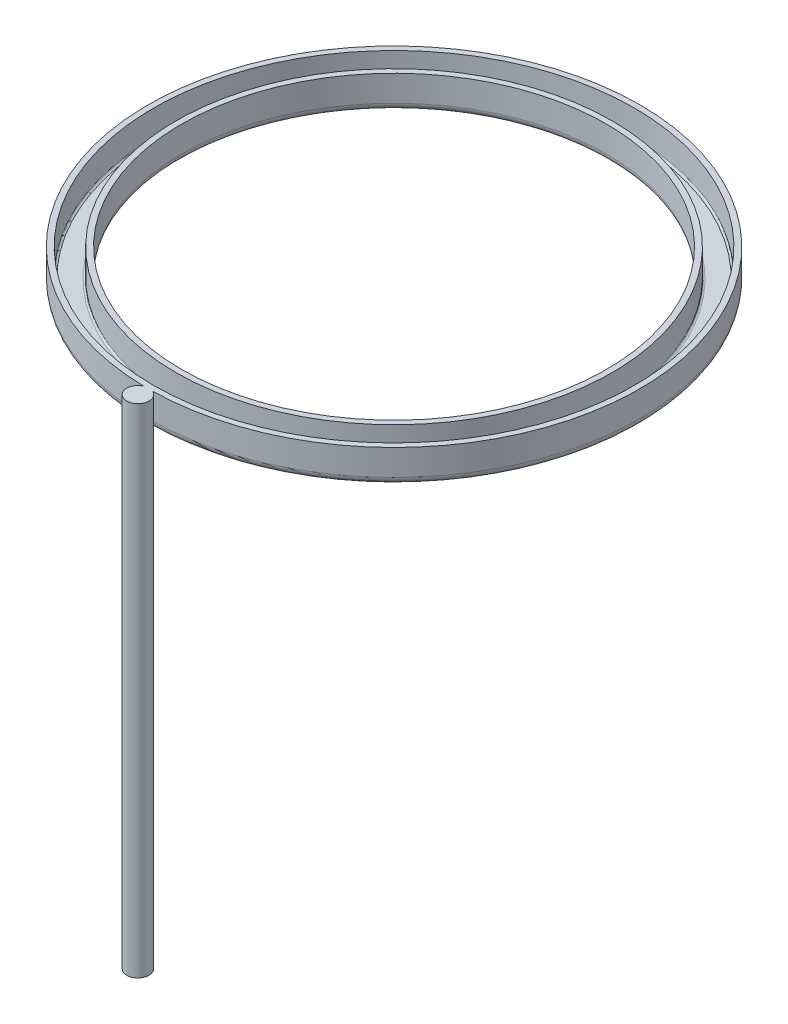
ISO-10303-21;
HEADER;
FILE_DESCRIPTION(('STEP AP214'),'2;1');
FILE_NAME('part.step','',(''),(''),'','','');
FILE_SCHEMA(('AUTOMOTIVE_DESIGN { 1 0 10303 214 1 1 1 1 }'));
ENDSEC;
DATA;
#1=APPLICATION_CONTEXT('core data for automotive mechanical design processes');
#2=APPLICATION_PROTOCOL_DEFINITION('international standard','automotive_design',2000,#1);
#3=PRODUCT_CONTEXT('',#1,'mechanical');
#4=PRODUCT('Part','Part','',(#3));
#5=PRODUCT_RELATED_PRODUCT_CATEGORY('part','',(#4));
#6=PRODUCT_DEFINITION_FORMATION('','',#4);
#7=PRODUCT_DEFINITION_CONTEXT('part definition',#1,'design');
#8=PRODUCT_DEFINITION('design','',#6,#7);
#9=PRODUCT_DEFINITION_SHAPE('','',#8);
#10=(LENGTH_UNIT() NAMED_UNIT(*) SI_UNIT(.MILLI.,.METRE.));
#11=(NAMED_UNIT(*) PLANE_ANGLE_UNIT() SI_UNIT($,.RADIAN.));
#12=(NAMED_UNIT(*) SI_UNIT($,.STERADIAN.) SOLID_ANGLE_UNIT());
#13=UNCERTAINTY_MEASURE_WITH_UNIT(LENGTH_MEASURE(1.E-05),#10,'distance_accuracy_value','');
#14=(GEOMETRIC_REPRESENTATION_CONTEXT(3) GLOBAL_UNCERTAINTY_ASSIGNED_CONTEXT((#13)) GLOBAL_UNIT_ASSIGNED_CONTEXT((#10,
#11,#12)) REPRESENTATION_CONTEXT('',''));
#15=CARTESIAN_POINT('',(0.,0.,0.));
#16=DIRECTION('',(0.,0.,1.));
#17=DIRECTION('',(1.,0.,0.));
#18=AXIS2_PLACEMENT_3D('',#15,#16,#17);
#19=CARTESIAN_POINT('',(0.,22.5592062491873,0.));
#20=DIRECTION('',(0.,1.,0.));
#21=DIRECTION('',(0.,0.,1.));
#22=AXIS2_PLACEMENT_3D('',#19,#20,#21);
#23=CYLINDRICAL_SURFACE('',#22,5.725);
#24=CARTESIAN_POINT('',(0.,0.900000000000001,0.));
#25=DIRECTION('',(0.,1.,0.));
#26=DIRECTION('',(0.,0.,1.));
#27=AXIS2_PLACEMENT_3D('',#24,#25,#26);
#28=CIRCLE('',#27,5.725);
#29=CARTESIAN_POINT('',(0.,0.900000000000001,5.725));
#30=VERTEX_POINT('',#29);
#31=EDGE_CURVE('E47',#30,#30,#28,.T.);
#32=ORIENTED_EDGE('',*,*,#31,.T.);
#33=EDGE_LOOP('',(#32));
#34=FACE_BOUND('',#33,.T.);
#35=CARTESIAN_POINT('',(0.,0.199999999999999,0.));
#36=DIRECTION('',(0.,1.,0.));
#37=DIRECTION('',(0.,0.,1.));
#38=AXIS2_PLACEMENT_3D('',#35,#36,#37);
#39=CIRCLE('',#38,5.725);
#40=CARTESIAN_POINT('',(0.,0.199999999999999,5.725));
#41=VERTEX_POINT('',#40);
#42=EDGE_CURVE('E76',#41,#41,#39,.T.);
#43=ORIENTED_EDGE('',*,*,#42,.F.);
#44=EDGE_LOOP('',(#43));
#45=FACE_BOUND('',#44,.T.);
#46=ADVANCED_FACE('F34',(#34,#45),#23,.F.);
#47=CARTESIAN_POINT('',(-5.875,0.9,0.));
#48=DIRECTION('',(0.,-1.,0.));
#49=DIRECTION('',(0.,0.,-1.));
#50=AXIS2_PLACEMENT_3D('',#47,#48,#49);
#51=PLANE('',#50);
#52=ORIENTED_EDGE('',*,*,#31,.F.);
#53=EDGE_LOOP('',(#52));
#54=FACE_BOUND('',#53,.T.);
#55=CARTESIAN_POINT('',(0.,0.899999999999998,0.));
#56=DIRECTION('',(0.,1.,0.));
#57=DIRECTION('',(0.,0.,1.));
#58=AXIS2_PLACEMENT_3D('',#55,#56,#57);
#59=CIRCLE('',#58,5.875);
#60=CARTESIAN_POINT('',(0.,0.899999999999998,5.875));
#61=VERTEX_POINT('',#60);
#62=EDGE_CURVE('E109',#61,#61,#59,.T.);
#63=ORIENTED_EDGE('',*,*,#62,.T.);
#64=EDGE_LOOP('',(#63));
#65=FACE_BOUND('',#64,.T.);
#66=ADVANCED_FACE('F116',(#54,#65),#51,.F.);
#67=CARTESIAN_POINT('',(0.,22.5592062491873,0.));
#68=DIRECTION('',(0.,1.,0.));
#69=DIRECTION('',(0.,0.,1.));
#70=AXIS2_PLACEMENT_3D('',#67,#68,#69);
#71=CYLINDRICAL_SURFACE('',#70,5.875);
#72=ORIENTED_EDGE('',*,*,#62,.F.);
#73=EDGE_LOOP('',(#72));
#74=FACE_BOUND('',#73,.T.);
#75=CARTESIAN_POINT('',(0.,0.199999999999999,0.));
#76=DIRECTION('',(0.,1.,0.));
#77=DIRECTION('',(0.,0.,1.));
#78=AXIS2_PLACEMENT_3D('',#75,#76,#77);
#79=CIRCLE('',#78,5.875);
#80=CARTESIAN_POINT('',(0.,0.199999999999999,5.875));
#81=VERTEX_POINT('',#80);
#82=EDGE_CURVE('E106',#81,#81,#79,.T.);
#83=ORIENTED_EDGE('',*,*,#82,.T.);
#84=EDGE_LOOP('',(#83));
#85=FACE_BOUND('',#84,.T.);
#86=ADVANCED_FACE('F119',(#74,#85),#71,.T.);
#87=CARTESIAN_POINT('',(0.,0.2,0.));
#88=DIRECTION('',(0.,1.,0.));
#89=DIRECTION('',(0.,0.,1.));
#90=AXIS2_PLACEMENT_3D('',#87,#88,#89);
#91=TOROIDAL_SURFACE('',#90,5.925,0.0499999999999998);
#92=ORIENTED_EDGE('',*,*,#82,.F.);
#93=EDGE_LOOP('',(#92));
#94=FACE_BOUND('',#93,.T.);
#95=CARTESIAN_POINT('',(0.,0.150000000000001,0.));
#96=DIRECTION('',(0.,1.,0.));
#97=DIRECTION('',(0.,0.,1.));
#98=AXIS2_PLACEMENT_3D('',#95,#96,#97);
#99=CIRCLE('',#98,5.925);
#100=CARTESIAN_POINT('',(0.,0.150000000000001,5.925));
#101=VERTEX_POINT('',#100);
#102=EDGE_CURVE('E103',#101,#101,#99,.T.);
#103=ORIENTED_EDGE('',*,*,#102,.T.);
#104=EDGE_LOOP('',(#103));
#105=FACE_BOUND('',#104,.T.);
#106=ADVANCED_FACE('F124',(#94,#105),#91,.F.);
#107=CARTESIAN_POINT('',(-6.425,0.15,0.));
#108=DIRECTION('',(0.,-1.,0.));
#109=DIRECTION('',(0.,0.,-1.));
#110=AXIS2_PLACEMENT_3D('',#107,#108,#109);
#111=PLANE('',#110);
#112=ORIENTED_EDGE('',*,*,#102,.F.);
#113=EDGE_LOOP('',(#112));
#114=FACE_BOUND('',#113,.T.);
#115=CARTESIAN_POINT('',(0.,0.150000000000001,0.));
#116=DIRECTION('',(0.,1.,0.));
#117=DIRECTION('',(0.,0.,1.));
#118=AXIS2_PLACEMENT_3D('',#115,#116,#117);
#119=CIRCLE('',#118,6.425);
#120=CARTESIAN_POINT('',(0.,0.150000000000001,6.425));
#121=VERTEX_POINT('',#120);
#122=EDGE_CURVE('E100',#121,#121,#119,.T.);
#123=ORIENTED_EDGE('',*,*,#122,.T.);
#124=EDGE_LOOP('',(#123));
#125=FACE_BOUND('',#124,.T.);
#126=ADVANCED_FACE('F130',(#114,#125),#111,.F.);
#127=CARTESIAN_POINT('',(0.,0.2,0.));
#128=DIRECTION('',(0.,1.,0.));
#129=DIRECTION('',(0.,0.,1.));
#130=AXIS2_PLACEMENT_3D('',#127,#128,#129);
#131=TOROIDAL_SURFACE('',#130,6.425,0.0500000000000003);
#132=ORIENTED_EDGE('',*,*,#122,.F.);
#133=EDGE_LOOP('',(#132));
#134=FACE_BOUND('',#133,.T.);
#135=CARTESIAN_POINT('',(0.,0.199999999999999,0.));
#136=DIRECTION('',(0.,1.,0.));
#137=DIRECTION('',(0.,0.,1.));
#138=AXIS2_PLACEMENT_3D('',#135,#136,#137);
#139=CIRCLE('',#138,6.475);
#140=CARTESIAN_POINT('',(0.,0.199999999999999,6.475));
#141=VERTEX_POINT('',#140);
#142=EDGE_CURVE('E97',#141,#141,#139,.T.);
#143=ORIENTED_EDGE('',*,*,#142,.T.);
#144=EDGE_LOOP('',(#143));
#145=FACE_BOUND('',#144,.T.);
#146=ADVANCED_FACE('F136',(#134,#145),#131,.F.);
#147=CARTESIAN_POINT('',(0.,22.5592062491873,0.));
#148=DIRECTION('',(0.,1.,0.));
#149=DIRECTION('',(0.,0.,1.));
#150=AXIS2_PLACEMENT_3D('',#147,#148,#149);
#151=CYLINDRICAL_SURFACE('',#150,6.475);
#152=ORIENTED_EDGE('',*,*,#142,.F.);
#153=EDGE_LOOP('',(#152));
#154=FACE_BOUND('',#153,.T.);
#155=CARTESIAN_POINT('',(0.,0.899999999999998,0.));
#156=DIRECTION('',(0.,1.,0.));
#157=DIRECTION('',(0.,0.,1.));
#158=AXIS2_PLACEMENT_3D('',#155,#156,#157);
#159=CIRCLE('',#158,6.475);
#160=CARTESIAN_POINT('',(0.,0.899999999999998,6.475));
#161=VERTEX_POINT('',#160);
#162=EDGE_CURVE('E94',#161,#161,#159,.T.);
#163=ORIENTED_EDGE('',*,*,#162,.T.);
#164=EDGE_LOOP('',(#163));
#165=FACE_BOUND('',#164,.T.);
#166=ADVANCED_FACE('F142',(#154,#165),#151,.F.);
#167=CARTESIAN_POINT('',(-6.625,0.9,0.));
#168=DIRECTION('',(0.,-1.,0.));
#169=DIRECTION('',(0.,0.,-1.));
#170=AXIS2_PLACEMENT_3D('',#167,#168,#169);
#171=PLANE('',#170);
#172=ORIENTED_EDGE('',*,*,#162,.F.);
#173=EDGE_LOOP('',(#172));
#174=FACE_BOUND('',#173,.T.);
#175=CARTESIAN_POINT('',(0.,0.900000000000001,0.));
#176=DIRECTION('',(0.,1.,0.));
#177=DIRECTION('',(0.,0.,1.));
#178=AXIS2_PLACEMENT_3D('',#175,#176,#177);
#179=CIRCLE('',#178,6.625);
#180=CARTESIAN_POINT('',(0.117477650061137,0.900000000000001,6.62395833333333));
#181=VERTEX_POINT('',#180);
#182=CARTESIAN_POINT('',(-0.117477650061137,0.900000000000001,6.62395833333333));
#183=VERTEX_POINT('',#182);
#184=EDGE_CURVE('E58',#181,#183,#179,.T.);
#185=ORIENTED_EDGE('',*,*,#184,.T.);
#186=CARTESIAN_POINT('',(0.,0.9,6.9));
#187=DIRECTION('',(0.,1.,0.));
#188=DIRECTION('',(0.,0.,1.));
#189=AXIS2_PLACEMENT_3D('',#186,#187,#188);
#190=CIRCLE('',#189,0.3);
#191=EDGE_CURVE('E79',#183,#181,#190,.T.);
#192=ORIENTED_EDGE('',*,*,#191,.T.);
#193=EDGE_LOOP('',(#185,#192));
#194=FACE_BOUND('',#193,.T.);
#195=ADVANCED_FACE('F148',(#174,#194),#171,.F.);
#196=CARTESIAN_POINT('',(0.,22.5592062491873,0.));
#197=DIRECTION('',(0.,1.,0.));
#198=DIRECTION('',(0.,0.,1.));
#199=AXIS2_PLACEMENT_3D('',#196,#197,#198);
#200=CYLINDRICAL_SURFACE('',#199,6.625);
#201=DIRECTION('',(0.,1.,0.));
#202=VECTOR('',#201,1.);
#203=CARTESIAN_POINT('',(0.117477650061136,-5.8,6.62395833333333));
#204=LINE('',#203,#202);
#205=CARTESIAN_POINT('',(0.117477650061137,0.20000000001393,6.62395833333333));
#206=VERTEX_POINT('',#205);
#207=EDGE_CURVE('E71',#206,#181,#204,.T.);
#208=ORIENTED_EDGE('',*,*,#207,.F.);
#209=CARTESIAN_POINT('',(0.,0.199999999999999,0.));
#210=DIRECTION('',(0.,1.,0.));
#211=DIRECTION('',(0.,0.,1.));
#212=AXIS2_PLACEMENT_3D('',#209,#210,#211);
#213=CIRCLE('',#212,6.625);
#214=CARTESIAN_POINT('',(-0.117477650061137,0.199999999999999,6.62395833333333));
#215=VERTEX_POINT('',#214);
#216=EDGE_CURVE('E66',#206,#215,#213,.T.);
#217=ORIENTED_EDGE('',*,*,#216,.T.);
#218=DIRECTION('',(0.,1.,0.));
#219=VECTOR('',#218,1.);
#220=CARTESIAN_POINT('',(-0.117477650061136,-5.8,6.62395833333333));
#221=LINE('',#220,#219);
#222=EDGE_CURVE('E54',#183,#215,#221,.F.);
#223=ORIENTED_EDGE('',*,*,#222,.F.);
#224=ORIENTED_EDGE('',*,*,#184,.F.);
#225=EDGE_LOOP('',(#208,#217,#223,#224));
#226=FACE_BOUND('',#225,.T.);
#227=ADVANCED_FACE('F72',(#226),#200,.T.);
#228=CARTESIAN_POINT('',(0.,0.2,0.));
#229=DIRECTION('',(0.,1.,0.));
#230=DIRECTION('',(0.,0.,1.));
#231=AXIS2_PLACEMENT_3D('',#228,#229,#230);
#232=TOROIDAL_SURFACE('',#231,6.425,0.2);
#233=CARTESIAN_POINT('',(-0.117477424452947,0.200199999999936,6.62395823731371));
#234=CARTESIAN_POINT('',(-0.117493358419675,0.195410567926204,6.62396867575194));
#235=CARTESIAN_POINT('',(-0.117111411832353,0.190624810307204,6.62380247469931));
#236=CARTESIAN_POINT('',(-0.115592218155275,0.18121547545121,6.62316134540012));
#237=CARTESIAN_POINT('',(-0.114458076688651,0.176591313322827,6.62268768673899));
#238=CARTESIAN_POINT('',(-0.111475294515229,0.167620988798098,6.62147590569512));
#239=CARTESIAN_POINT('',(-0.109627053413964,0.163274672503543,6.62073793123861));
#240=CARTESIAN_POINT('',(-0.105283122863901,0.15495781606709,6.6190713715067));
#241=CARTESIAN_POINT('',(-0.102787040280426,0.150987506103767,6.61814267056293));
#242=CARTESIAN_POINT('',(-0.0971175200584906,0.143344643421387,6.61613816113953));
#243=CARTESIAN_POINT('',(-0.0939207509592384,0.139690652763249,6.61505791919867));
#244=CARTESIAN_POINT('',(-0.0870173740080533,0.132911219052218,6.61287443187822));
#245=CARTESIAN_POINT('',(-0.0833105586161431,0.129785992315694,6.61177117729051));
#246=CARTESIAN_POINT('',(-0.0749586864551937,0.123690627800654,6.60947919379753));
#247=CARTESIAN_POINT('',(-0.0702545268975759,0.120798433410196,6.60829904312042));
#248=CARTESIAN_POINT('',(-0.0604535476620065,0.115697275042116,6.6061111693056));
#249=CARTESIAN_POINT('',(-0.0553565101720337,0.113488693513035,6.60510354282724));
#250=CARTESIAN_POINT('',(-0.0439978896572318,0.109407251831239,6.60317904893592));
#251=CARTESIAN_POINT('',(-0.0376854336848521,0.107654900243559,6.60230657462613));
#252=CARTESIAN_POINT('',(-0.0248426749893189,0.105001102401386,6.600960456815));
#253=CARTESIAN_POINT('',(-0.0183122328793765,0.104100211821134,6.60048707378742));
#254=CARTESIAN_POINT('',(-0.00423247318337452,0.103051964691408,6.59993591512828));
#255=CARTESIAN_POINT('',(0.00332914857048123,0.103030611707442,6.59992430013409));
#256=CARTESIAN_POINT('',(0.0183643408044509,0.104063339819727,6.6004680009375));
#257=CARTESIAN_POINT('',(0.0258378332769263,0.105118310503039,6.60102378569415));
#258=CARTESIAN_POINT('',(0.0407730438593247,0.108411497098034,6.60268511978922));
#259=CARTESIAN_POINT('',(0.0482227670191234,0.110694565838593,6.60381140758712));
#260=CARTESIAN_POINT('',(0.0625112592961097,0.116550402861268,6.60649547199155));
#261=CARTESIAN_POINT('',(0.0693511353291755,0.120120772606431,6.60805244488525));
#262=CARTESIAN_POINT('',(0.0802901355077364,0.127410484680106,6.61090475122547));
#263=CARTESIAN_POINT('',(0.0846191436862528,0.130805686922304,6.61215056309705));
#264=CARTESIAN_POINT('',(0.0926443223034685,0.13828194140605,6.61463249389704));
#265=CARTESIAN_POINT('',(0.0963409115702602,0.14236253616006,6.61586861871913));
#266=CARTESIAN_POINT('',(0.102977583818124,0.151185866883813,6.61820546817975));
#267=CARTESIAN_POINT('',(0.105911984235637,0.15593319156381,6.61930514551349));
#268=CARTESIAN_POINT('',(0.110847880312594,0.165942611639706,6.62121727586969));
#269=CARTESIAN_POINT('',(0.112850518821425,0.171204066790047,6.62203008045779));
#270=CARTESIAN_POINT('',(0.115382970083866,0.180444206993945,6.62307383863291));
#271=CARTESIAN_POINT('',(0.116173224633171,0.184341931899036,6.62340578739462));
#272=CARTESIAN_POINT('',(0.117226210141097,0.192225372438092,6.6238513219509));
#273=CARTESIAN_POINT('',(0.117488224255034,0.196211200230774,6.62396461100611));
#274=CARTESIAN_POINT('',(0.117477424451954,0.200199999999631,6.62395823731882));
#275=B_SPLINE_CURVE_WITH_KNOTS('',3,(#233,#234,#235,#236,#237,#238,#239,#240,#241,#242,#243,
#244,#245,#246,#247,#248,#249,#250,#251,#252,#253,#254,#255,#256,#257,#258,#259,#260,#261,#262,
#263,#264,#265,#266,#267,#268,#269,#270,#271,#272,#273,#274),.UNSPECIFIED.,.F.,.F.,(4,2,2,2,2,2,
2,2,2,2,2,2,2,2,2,2,2,2,2,2,4),(0.,0.0143418504793326,0.0286248526540294,0.0428998737023752,
0.0571835777095052,0.0720455547284063,0.0869135971307995,0.103789556289038,0.120674939741564,
0.140424741415388,0.160187423178223,0.18277276505724,0.205376788971977,0.228868754204609,
0.252317172818816,0.269172683469214,0.286016987748055,0.302983487898271,0.319929122625966,
0.331861880852947,0.343810821468656),.UNSPECIFIED.);
#276=EDGE_CURVE('E11',#215,#206,#275,.T.);
#277=ORIENTED_EDGE('',*,*,#276,.F.);
#278=ORIENTED_EDGE('',*,*,#216,.F.);
#279=EDGE_LOOP('',(#277,#278));
#280=FACE_BOUND('',#279,.T.);
#281=CARTESIAN_POINT('',(0.,0.,0.));
#282=DIRECTION('',(0.,1.,0.));
#283=DIRECTION('',(0.,0.,1.));
#284=AXIS2_PLACEMENT_3D('',#281,#282,#283);
#285=CIRCLE('',#284,6.425);
#286=CARTESIAN_POINT('',(0.,0.,6.425));
#287=VERTEX_POINT('',#286);
#288=EDGE_CURVE('E69',#287,#287,#285,.T.);
#289=ORIENTED_EDGE('',*,*,#288,.T.);
#290=EDGE_LOOP('',(#289));
#291=FACE_BOUND('',#290,.T.);
#292=ADVANCED_FACE('F67',(#280,#291),#232,.T.);
#293=CARTESIAN_POINT('',(-6.425,0.,0.));
#294=DIRECTION('',(0.,-1.,0.));
#295=DIRECTION('',(0.,0.,-1.));
#296=AXIS2_PLACEMENT_3D('',#293,#294,#295);
#297=PLANE('',#296);
#298=CARTESIAN_POINT('',(0.,0.,0.));
#299=DIRECTION('',(0.,1.,0.));
#300=DIRECTION('',(0.,0.,1.));
#301=AXIS2_PLACEMENT_3D('',#298,#299,#300);
#302=CIRCLE('',#301,5.925);
#303=CARTESIAN_POINT('',(0.,0.,5.925));
#304=VERTEX_POINT('',#303);
#305=EDGE_CURVE('E88',#304,#304,#302,.T.);
#306=ORIENTED_EDGE('',*,*,#305,.T.);
#307=EDGE_LOOP('',(#306));
#308=FACE_BOUND('',#307,.T.);
#309=ORIENTED_EDGE('',*,*,#288,.F.);
#310=EDGE_LOOP('',(#309));
#311=FACE_BOUND('',#310,.T.);
#312=ADVANCED_FACE('F196',(#308,#311),#297,.T.);
#313=CARTESIAN_POINT('',(0.,0.2,0.));
#314=DIRECTION('',(0.,1.,0.));
#315=DIRECTION('',(0.,0.,1.));
#316=AXIS2_PLACEMENT_3D('',#313,#314,#315);
#317=TOROIDAL_SURFACE('',#316,5.925,0.2);
#318=ORIENTED_EDGE('',*,*,#42,.T.);
#319=EDGE_LOOP('',(#318));
#320=FACE_BOUND('',#319,.T.);
#321=ORIENTED_EDGE('',*,*,#305,.F.);
#322=EDGE_LOOP('',(#321));
#323=FACE_BOUND('',#322,.T.);
#324=ADVANCED_FACE('F201',(#320,#323),#317,.T.);
#325=CARTESIAN_POINT('',(0.,-12.5,6.9));
#326=DIRECTION('',(0.,1.,0.));
#327=DIRECTION('',(0.,0.,1.));
#328=AXIS2_PLACEMENT_3D('',#325,#326,#327);
#329=CYLINDRICAL_SURFACE('',#328,0.3);
#330=CARTESIAN_POINT('',(0.,-12.5,6.9));
#331=DIRECTION('',(0.,1.,0.));
#332=DIRECTION('',(0.,0.,1.));
#333=AXIS2_PLACEMENT_3D('',#330,#331,#332);
#334=CIRCLE('',#333,0.3);
#335=CARTESIAN_POINT('',(0.,-12.5,7.2));
#336=VERTEX_POINT('',#335);
#337=EDGE_CURVE('E80',#336,#336,#334,.T.);
#338=ORIENTED_EDGE('',*,*,#337,.T.);
#339=EDGE_LOOP('',(#338));
#340=FACE_BOUND('',#339,.T.);
#341=ORIENTED_EDGE('',*,*,#276,.T.);
#342=ORIENTED_EDGE('',*,*,#207,.T.);
#343=ORIENTED_EDGE('',*,*,#191,.F.);
#344=ORIENTED_EDGE('',*,*,#222,.T.);
#345=EDGE_LOOP('',(#341,#342,#343,#344));
#346=FACE_BOUND('',#345,.T.);
#347=ADVANCED_FACE('F78',(#340,#346),#329,.T.);
#348=CARTESIAN_POINT('',(0.,-12.5,6.9));
#349=DIRECTION('',(0.,1.,0.));
#350=DIRECTION('',(0.,0.,1.));
#351=AXIS2_PLACEMENT_3D('',#348,#349,#350);
#352=PLANE('',#351);
#353=ORIENTED_EDGE('',*,*,#337,.F.);
#354=EDGE_LOOP('',(#353));
#355=FACE_BOUND('',#354,.T.);
#356=ADVANCED_FACE('F237',(#355),#352,.F.);
#357=CLOSED_SHELL('',(#46,#66,#86,#106,#126,#146,#166,#195,#227,#292,#312,#324,#347,#356));
#358=MANIFOLD_SOLID_BREP('B2',#357);
#359=ADVANCED_BREP_SHAPE_REPRESENTATION('',(#18,#358),#14);
#360=SHAPE_DEFINITION_REPRESENTATION(#9,#359);
ENDSEC;
END-ISO-10303-21;
